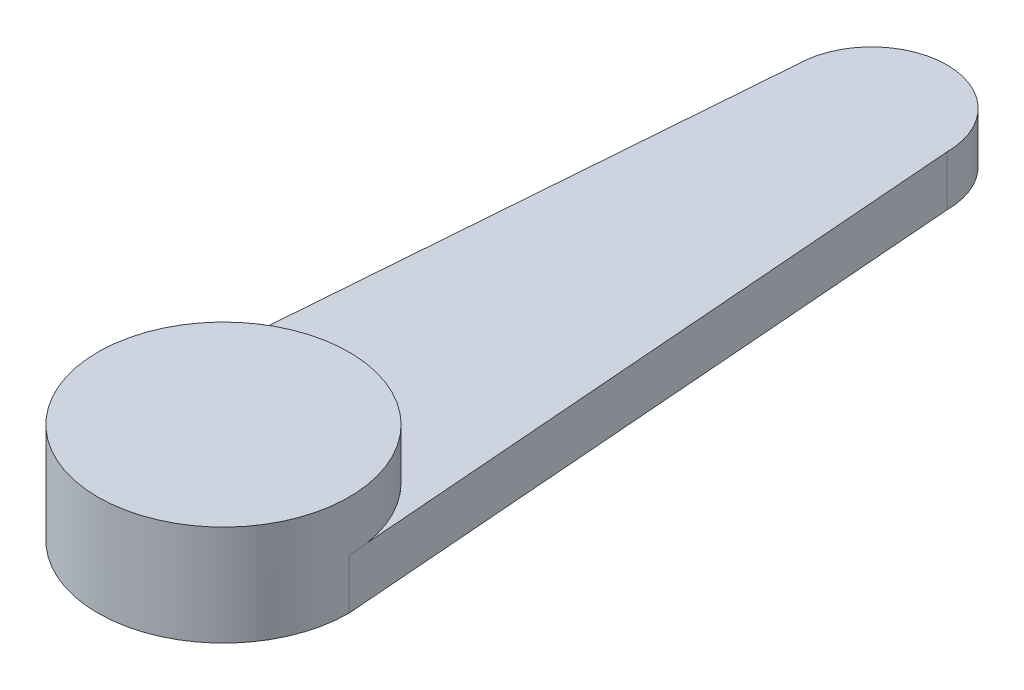
ISO-10303-21;
HEADER;
FILE_DESCRIPTION(('STEP AP214'),'2;1');
FILE_NAME('part.step','',(''),(''),'','','');
FILE_SCHEMA(('AUTOMOTIVE_DESIGN { 1 0 10303 214 1 1 1 1 }'));
ENDSEC;
DATA;
#1=APPLICATION_CONTEXT('core data for automotive mechanical design processes');
#2=APPLICATION_PROTOCOL_DEFINITION('international standard','automotive_design',2000,#1);
#3=PRODUCT_CONTEXT('',#1,'mechanical');
#4=PRODUCT('Part','Part','',(#3));
#5=PRODUCT_RELATED_PRODUCT_CATEGORY('part','',(#4));
#6=PRODUCT_DEFINITION_FORMATION('','',#4);
#7=PRODUCT_DEFINITION_CONTEXT('part definition',#1,'design');
#8=PRODUCT_DEFINITION('design','',#6,#7);
#9=PRODUCT_DEFINITION_SHAPE('','',#8);
#10=(LENGTH_UNIT() NAMED_UNIT(*) SI_UNIT(.MILLI.,.METRE.));
#11=(NAMED_UNIT(*) PLANE_ANGLE_UNIT() SI_UNIT($,.RADIAN.));
#12=(NAMED_UNIT(*) SI_UNIT($,.STERADIAN.) SOLID_ANGLE_UNIT());
#13=UNCERTAINTY_MEASURE_WITH_UNIT(LENGTH_MEASURE(1.E-05),#10,'distance_accuracy_value','');
#14=(GEOMETRIC_REPRESENTATION_CONTEXT(3) GLOBAL_UNCERTAINTY_ASSIGNED_CONTEXT((#13)) GLOBAL_UNIT_ASSIGNED_CONTEXT((#10,
#11,#12)) REPRESENTATION_CONTEXT('',''));
#15=CARTESIAN_POINT('',(0.,0.,0.));
#16=DIRECTION('',(0.,0.,1.));
#17=DIRECTION('',(1.,0.,0.));
#18=AXIS2_PLACEMENT_3D('',#15,#16,#17);
#19=CARTESIAN_POINT('',(3.94504323218446,1.5875,-0.305817304820501));
#20=DIRECTION('',(0.997008847092309,0.,-0.0772875075265356));
#21=DIRECTION('',(-0.0772875075265356,0.,-0.997008847092309));
#22=AXIS2_PLACEMENT_3D('',#19,#20,#21);
#23=PLANE('',#22);
#24=DIRECTION('',(0.0772875075265356,0.,0.997008847092309));
#25=VECTOR('',#24,1.);
#26=CARTESIAN_POINT('',(3.94504323218446,0.,-0.305817304820501));
#27=LINE('',#26,#25);
#28=CARTESIAN_POINT('',(2.38125,0.,-20.47875));
#29=VERTEX_POINT('',#28);
#30=CARTESIAN_POINT('',(3.96875,0.,0.));
#31=VERTEX_POINT('',#30);
#32=EDGE_CURVE('E108',#29,#31,#27,.T.);
#33=ORIENTED_EDGE('',*,*,#32,.F.);
#34=DIRECTION('',(0.,-1.,0.));
#35=VECTOR('',#34,1.);
#36=CARTESIAN_POINT('',(2.38125,1.5875,-20.47875));
#37=LINE('',#36,#35);
#38=CARTESIAN_POINT('',(2.38125,1.5875,-20.47875));
#39=VERTEX_POINT('',#38);
#40=EDGE_CURVE('E40',#39,#29,#37,.T.);
#41=ORIENTED_EDGE('',*,*,#40,.F.);
#42=DIRECTION('',(0.0772875075265356,0.,0.997008847092309));
#43=VECTOR('',#42,1.);
#44=CARTESIAN_POINT('',(3.94504323218446,1.5875,-0.305817304820501));
#45=LINE('',#44,#43);
#46=CARTESIAN_POINT('',(3.92133646436892,1.5875,-0.611634609641002));
#47=VERTEX_POINT('',#46);
#48=EDGE_CURVE('E102',#39,#47,#45,.T.);
#49=ORIENTED_EDGE('',*,*,#48,.T.);
#50=CARTESIAN_POINT('',(3.96875,1.5875,0.));
#51=VERTEX_POINT('',#50);
#52=EDGE_CURVE('E101',#47,#51,#45,.T.);
#53=ORIENTED_EDGE('',*,*,#52,.T.);
#54=DIRECTION('',(0.,-1.,0.));
#55=VECTOR('',#54,1.);
#56=CARTESIAN_POINT('',(3.96875,1.5875,0.));
#57=LINE('',#56,#55);
#58=EDGE_CURVE('E86',#51,#31,#57,.T.);
#59=ORIENTED_EDGE('',*,*,#58,.T.);
#60=EDGE_LOOP('',(#33,#41,#49,#53,#59));
#61=FACE_BOUND('',#60,.T.);
#62=ADVANCED_FACE('F37',(#61),#23,.T.);
#63=CARTESIAN_POINT('',(0.,1.5875,-20.47875));
#64=DIRECTION('',(0.,-1.,0.));
#65=DIRECTION('',(0.,0.,-1.));
#66=AXIS2_PLACEMENT_3D('',#63,#64,#65);
#67=CYLINDRICAL_SURFACE('',#66,2.38125);
#68=CARTESIAN_POINT('',(0.,0.,-20.47875));
#69=DIRECTION('',(0.,1.,0.));
#70=DIRECTION('',(0.,0.,1.));
#71=AXIS2_PLACEMENT_3D('',#68,#69,#70);
#72=CIRCLE('',#71,2.38125);
#73=CARTESIAN_POINT('',(-2.38125,0.,-20.47875));
#74=VERTEX_POINT('',#73);
#75=EDGE_CURVE('E116',#29,#74,#72,.T.);
#76=ORIENTED_EDGE('',*,*,#75,.T.);
#77=DIRECTION('',(0.,-1.,0.));
#78=VECTOR('',#77,1.);
#79=CARTESIAN_POINT('',(-2.38125,1.5875,-20.47875));
#80=LINE('',#79,#78);
#81=CARTESIAN_POINT('',(-2.38125,1.5875,-20.47875));
#82=VERTEX_POINT('',#81);
#83=EDGE_CURVE('E121',#82,#74,#80,.T.);
#84=ORIENTED_EDGE('',*,*,#83,.F.);
#85=CARTESIAN_POINT('',(0.,1.5875,-20.47875));
#86=DIRECTION('',(0.,1.,0.));
#87=DIRECTION('',(0.,0.,1.));
#88=AXIS2_PLACEMENT_3D('',#85,#86,#87);
#89=CIRCLE('',#88,2.38125);
#90=EDGE_CURVE('E112',#39,#82,#89,.T.);
#91=ORIENTED_EDGE('',*,*,#90,.F.);
#92=ORIENTED_EDGE('',*,*,#40,.T.);
#93=EDGE_LOOP('',(#76,#84,#91,#92));
#94=FACE_BOUND('',#93,.T.);
#95=ADVANCED_FACE('F128',(#94),#67,.T.);
#96=CARTESIAN_POINT('',(-3.94504323218446,1.5875,-0.305817304820501));
#97=DIRECTION('',(0.997008847092309,0.,0.0772875075265356));
#98=DIRECTION('',(0.0772875075265356,0.,-0.997008847092309));
#99=AXIS2_PLACEMENT_3D('',#96,#97,#98);
#100=PLANE('',#99);
#101=DIRECTION('',(-0.0772875075265356,0.,0.997008847092309));
#102=VECTOR('',#101,1.);
#103=CARTESIAN_POINT('',(-3.94504323218446,0.,-0.305817304820501));
#104=LINE('',#103,#102);
#105=CARTESIAN_POINT('',(-3.96875,0.,0.));
#106=VERTEX_POINT('',#105);
#107=EDGE_CURVE('E118',#74,#106,#104,.T.);
#108=ORIENTED_EDGE('',*,*,#107,.T.);
#109=DIRECTION('',(0.,-1.,0.));
#110=VECTOR('',#109,1.);
#111=CARTESIAN_POINT('',(-3.96875,1.5875,0.));
#112=LINE('',#111,#110);
#113=CARTESIAN_POINT('',(-3.96875,1.5875,0.));
#114=VERTEX_POINT('',#113);
#115=EDGE_CURVE('E97',#114,#106,#112,.T.);
#116=ORIENTED_EDGE('',*,*,#115,.F.);
#117=DIRECTION('',(-0.0772875075265356,0.,0.997008847092309));
#118=VECTOR('',#117,1.);
#119=CARTESIAN_POINT('',(-3.94504323218446,1.5875,-0.305817304820501));
#120=LINE('',#119,#118);
#121=CARTESIAN_POINT('',(-3.92133646436892,1.5875,-0.611634609641002));
#122=VERTEX_POINT('',#121);
#123=EDGE_CURVE('E54',#122,#114,#120,.T.);
#124=ORIENTED_EDGE('',*,*,#123,.F.);
#125=EDGE_CURVE('E98',#82,#122,#120,.T.);
#126=ORIENTED_EDGE('',*,*,#125,.F.);
#127=ORIENTED_EDGE('',*,*,#83,.T.);
#128=EDGE_LOOP('',(#108,#116,#124,#126,#127));
#129=FACE_BOUND('',#128,.T.);
#130=ADVANCED_FACE('F131',(#129),#100,.F.);
#131=CARTESIAN_POINT('',(0.,1.5875,0.));
#132=DIRECTION('',(0.,-1.,0.));
#133=DIRECTION('',(0.,0.,-1.));
#134=AXIS2_PLACEMENT_3D('',#131,#132,#133);
#135=CYLINDRICAL_SURFACE('',#134,3.96875);
#136=CARTESIAN_POINT('',(0.,0.,0.));
#137=DIRECTION('',(0.,1.,0.));
#138=DIRECTION('',(0.,0.,1.));
#139=AXIS2_PLACEMENT_3D('',#136,#137,#138);
#140=CIRCLE('',#139,3.96875);
#141=EDGE_CURVE('E93',#106,#31,#140,.T.);
#142=ORIENTED_EDGE('',*,*,#141,.T.);
#143=ORIENTED_EDGE('',*,*,#58,.F.);
#144=CARTESIAN_POINT('',(0.,1.5875,0.));
#145=DIRECTION('',(0.,1.,0.));
#146=DIRECTION('',(0.,0.,1.));
#147=AXIS2_PLACEMENT_3D('',#144,#145,#146);
#148=CIRCLE('',#147,3.96875);
#149=EDGE_CURVE('E46',#51,#47,#148,.T.);
#150=ORIENTED_EDGE('',*,*,#149,.T.);
#151=EDGE_CURVE('E11',#47,#122,#148,.T.);
#152=ORIENTED_EDGE('',*,*,#151,.T.);
#153=EDGE_CURVE('E47',#122,#114,#148,.T.);
#154=ORIENTED_EDGE('',*,*,#153,.T.);
#155=ORIENTED_EDGE('',*,*,#115,.T.);
#156=EDGE_LOOP('',(#142,#143,#150,#152,#154,#155));
#157=FACE_BOUND('',#156,.T.);
#158=CARTESIAN_POINT('',(0.,3.175,0.));
#159=DIRECTION('',(0.,1.,0.));
#160=DIRECTION('',(0.,0.,1.));
#161=AXIS2_PLACEMENT_3D('',#158,#159,#160);
#162=CIRCLE('',#161,3.96875);
#163=CARTESIAN_POINT('',(0.,3.175,3.96875));
#164=VERTEX_POINT('',#163);
#165=EDGE_CURVE('E106',#164,#164,#162,.T.);
#166=ORIENTED_EDGE('',*,*,#165,.F.);
#167=EDGE_LOOP('',(#166));
#168=FACE_BOUND('',#167,.T.);
#169=ADVANCED_FACE('F88',(#157,#168),#135,.T.);
#170=CARTESIAN_POINT('',(0.,1.5875,0.));
#171=DIRECTION('',(0.,1.,0.));
#172=DIRECTION('',(0.,0.,1.));
#173=AXIS2_PLACEMENT_3D('',#170,#171,#172);
#174=PLANE('',#173);
#175=ORIENTED_EDGE('',*,*,#151,.F.);
#176=ORIENTED_EDGE('',*,*,#48,.F.);
#177=ORIENTED_EDGE('',*,*,#90,.T.);
#178=ORIENTED_EDGE('',*,*,#125,.T.);
#179=EDGE_LOOP('',(#175,#176,#177,#178));
#180=FACE_BOUND('',#179,.T.);
#181=ADVANCED_FACE('F144',(#180),#174,.T.);
#182=CARTESIAN_POINT('',(0.,0.,0.));
#183=DIRECTION('',(0.,1.,0.));
#184=DIRECTION('',(0.,0.,1.));
#185=AXIS2_PLACEMENT_3D('',#182,#183,#184);
#186=PLANE('',#185);
#187=ORIENTED_EDGE('',*,*,#32,.T.);
#188=ORIENTED_EDGE('',*,*,#141,.F.);
#189=ORIENTED_EDGE('',*,*,#107,.F.);
#190=ORIENTED_EDGE('',*,*,#75,.F.);
#191=EDGE_LOOP('',(#187,#188,#189,#190));
#192=FACE_BOUND('',#191,.T.);
#193=ADVANCED_FACE('F130',(#192),#186,.F.);
#194=CARTESIAN_POINT('',(0.,1.5875,0.));
#195=DIRECTION('',(0.,1.,0.));
#196=DIRECTION('',(0.,0.,1.));
#197=AXIS2_PLACEMENT_3D('',#194,#195,#196);
#198=PLANE('',#197);
#199=ORIENTED_EDGE('',*,*,#153,.F.);
#200=ORIENTED_EDGE('',*,*,#123,.T.);
#201=EDGE_LOOP('',(#199,#200));
#202=FACE_BOUND('',#201,.T.);
#203=ADVANCED_FACE('F134',(#202),#198,.F.);
#204=CARTESIAN_POINT('',(0.,3.175,0.));
#205=DIRECTION('',(0.,1.,0.));
#206=DIRECTION('',(0.,0.,1.));
#207=AXIS2_PLACEMENT_3D('',#204,#205,#206);
#208=PLANE('',#207);
#209=ORIENTED_EDGE('',*,*,#165,.T.);
#210=EDGE_LOOP('',(#209));
#211=FACE_BOUND('',#210,.T.);
#212=ADVANCED_FACE('F136',(#211),#208,.T.);
#213=ORIENTED_EDGE('',*,*,#52,.F.);
#214=ORIENTED_EDGE('',*,*,#149,.F.);
#215=EDGE_LOOP('',(#213,#214));
#216=FACE_BOUND('',#215,.T.);
#217=ADVANCED_FACE('F105',(#216),#198,.F.);
#218=CLOSED_SHELL('',(#62,#95,#130,#169,#181,#193,#203,#212,#217));
#219=MANIFOLD_SOLID_BREP('B2',#218);
#220=ADVANCED_BREP_SHAPE_REPRESENTATION('',(#18,#219),#14);
#221=SHAPE_DEFINITION_REPRESENTATION(#9,#220);
ENDSEC;
END-ISO-10303-21;
